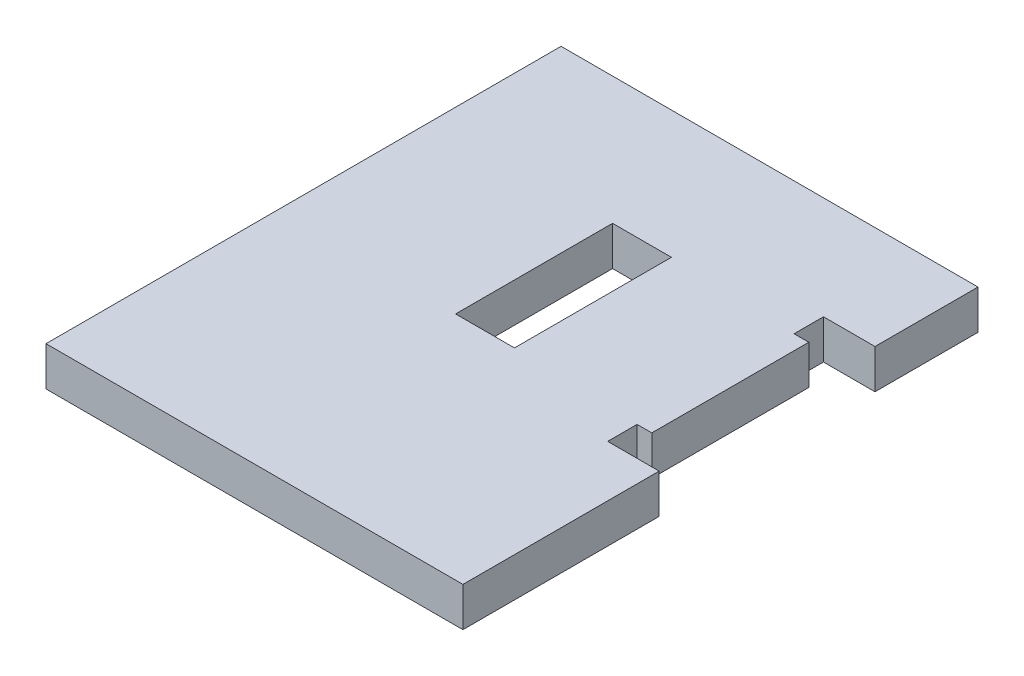
ISO-10303-21;
HEADER;
FILE_DESCRIPTION(('STEP AP214'),'2;1');
FILE_NAME('part.step','',(''),(''),'','','');
FILE_SCHEMA(('AUTOMOTIVE_DESIGN { 1 0 10303 214 1 1 1 1 }'));
ENDSEC;
DATA;
#1=APPLICATION_CONTEXT('core data for automotive mechanical design processes');
#2=APPLICATION_PROTOCOL_DEFINITION('international standard','automotive_design',2000,#1);
#3=PRODUCT_CONTEXT('',#1,'mechanical');
#4=PRODUCT('Part','Part','',(#3));
#5=PRODUCT_RELATED_PRODUCT_CATEGORY('part','',(#4));
#6=PRODUCT_DEFINITION_FORMATION('','',#4);
#7=PRODUCT_DEFINITION_CONTEXT('part definition',#1,'design');
#8=PRODUCT_DEFINITION('design','',#6,#7);
#9=PRODUCT_DEFINITION_SHAPE('','',#8);
#10=(LENGTH_UNIT() NAMED_UNIT(*) SI_UNIT(.MILLI.,.METRE.));
#11=(NAMED_UNIT(*) PLANE_ANGLE_UNIT() SI_UNIT($,.RADIAN.));
#12=(NAMED_UNIT(*) SI_UNIT($,.STERADIAN.) SOLID_ANGLE_UNIT());
#13=UNCERTAINTY_MEASURE_WITH_UNIT(LENGTH_MEASURE(1.E-05),#10,'distance_accuracy_value','');
#14=(GEOMETRIC_REPRESENTATION_CONTEXT(3) GLOBAL_UNCERTAINTY_ASSIGNED_CONTEXT((#13)) GLOBAL_UNIT_ASSIGNED_CONTEXT((#10,
#11,#12)) REPRESENTATION_CONTEXT('',''));
#15=CARTESIAN_POINT('',(0.,0.,0.));
#16=DIRECTION('',(0.,0.,1.));
#17=DIRECTION('',(1.,0.,0.));
#18=AXIS2_PLACEMENT_3D('',#15,#16,#17);
#19=CARTESIAN_POINT('',(0.,1.6,-21.));
#20=DIRECTION('',(-1.,0.,0.));
#21=DIRECTION('',(0.,0.,1.));
#22=AXIS2_PLACEMENT_3D('',#19,#20,#21);
#23=PLANE('',#22);
#24=DIRECTION('',(0.,0.,-1.));
#25=VECTOR('',#24,1.);
#26=CARTESIAN_POINT('',(0.,0.,-21.));
#27=LINE('',#26,#25);
#28=CARTESIAN_POINT('',(0.,0.,0.));
#29=VERTEX_POINT('',#28);
#30=CARTESIAN_POINT('',(0.,0.,-8.));
#31=VERTEX_POINT('',#30);
#32=EDGE_CURVE('E191',#29,#31,#27,.T.);
#33=ORIENTED_EDGE('',*,*,#32,.T.);
#34=DIRECTION('',(0.,1.,0.));
#35=VECTOR('',#34,1.);
#36=CARTESIAN_POINT('',(0.,-8.4,-8.));
#37=LINE('',#36,#35);
#38=CARTESIAN_POINT('',(0.,1.6,-8.));
#39=VERTEX_POINT('',#38);
#40=EDGE_CURVE('E249',#31,#39,#37,.T.);
#41=ORIENTED_EDGE('',*,*,#40,.T.);
#42=DIRECTION('',(0.,0.,-1.));
#43=VECTOR('',#42,1.);
#44=CARTESIAN_POINT('',(0.,1.6,-21.));
#45=LINE('',#44,#43);
#46=CARTESIAN_POINT('',(0.,1.6,0.));
#47=VERTEX_POINT('',#46);
#48=EDGE_CURVE('E173',#47,#39,#45,.T.);
#49=ORIENTED_EDGE('',*,*,#48,.F.);
#50=DIRECTION('',(0.,-1.,0.));
#51=VECTOR('',#50,1.);
#52=CARTESIAN_POINT('',(0.,1.6,0.));
#53=LINE('',#52,#51);
#54=EDGE_CURVE('E199',#47,#29,#53,.T.);
#55=ORIENTED_EDGE('',*,*,#54,.T.);
#56=EDGE_LOOP('',(#33,#41,#49,#55));
#57=FACE_BOUND('',#56,.T.);
#58=ADVANCED_FACE('F35',(#57),#23,.F.);
#59=CARTESIAN_POINT('',(-17.,1.6,-21.));
#60=DIRECTION('',(1.,0.,0.));
#61=DIRECTION('',(0.,0.,-1.));
#62=AXIS2_PLACEMENT_3D('',#59,#60,#61);
#63=PLANE('',#62);
#64=DIRECTION('',(0.,0.,1.));
#65=VECTOR('',#64,1.);
#66=CARTESIAN_POINT('',(-17.,0.,-21.));
#67=LINE('',#66,#65);
#68=CARTESIAN_POINT('',(-17.,0.,-21.));
#69=VERTEX_POINT('',#68);
#70=CARTESIAN_POINT('',(-17.,0.,0.));
#71=VERTEX_POINT('',#70);
#72=EDGE_CURVE('E184',#69,#71,#67,.T.);
#73=ORIENTED_EDGE('',*,*,#72,.T.);
#74=DIRECTION('',(0.,-1.,0.));
#75=VECTOR('',#74,1.);
#76=CARTESIAN_POINT('',(-17.,1.6,0.));
#77=LINE('',#76,#75);
#78=CARTESIAN_POINT('',(-17.,1.6,0.));
#79=VERTEX_POINT('',#78);
#80=EDGE_CURVE('E202',#79,#71,#77,.T.);
#81=ORIENTED_EDGE('',*,*,#80,.F.);
#82=DIRECTION('',(0.,0.,1.));
#83=VECTOR('',#82,1.);
#84=CARTESIAN_POINT('',(-17.,1.6,-21.));
#85=LINE('',#84,#83);
#86=CARTESIAN_POINT('',(-17.,1.6,-21.));
#87=VERTEX_POINT('',#86);
#88=EDGE_CURVE('E178',#87,#79,#85,.T.);
#89=ORIENTED_EDGE('',*,*,#88,.F.);
#90=DIRECTION('',(0.,-1.,0.));
#91=VECTOR('',#90,1.);
#92=CARTESIAN_POINT('',(-17.,1.6,-21.));
#93=LINE('',#92,#91);
#94=EDGE_CURVE('E183',#87,#69,#93,.T.);
#95=ORIENTED_EDGE('',*,*,#94,.T.);
#96=EDGE_LOOP('',(#73,#81,#89,#95));
#97=FACE_BOUND('',#96,.T.);
#98=ADVANCED_FACE('F37',(#97),#63,.F.);
#99=CARTESIAN_POINT('',(-17.,1.6,0.));
#100=DIRECTION('',(0.,0.,-1.));
#101=DIRECTION('',(-1.,0.,0.));
#102=AXIS2_PLACEMENT_3D('',#99,#100,#101);
#103=PLANE('',#102);
#104=DIRECTION('',(1.,0.,0.));
#105=VECTOR('',#104,1.);
#106=CARTESIAN_POINT('',(-17.,0.,0.));
#107=LINE('',#106,#105);
#108=EDGE_CURVE('E187',#71,#29,#107,.T.);
#109=ORIENTED_EDGE('',*,*,#108,.T.);
#110=ORIENTED_EDGE('',*,*,#54,.F.);
#111=DIRECTION('',(1.,0.,0.));
#112=VECTOR('',#111,1.);
#113=CARTESIAN_POINT('',(-17.,1.6,0.));
#114=LINE('',#113,#112);
#115=EDGE_CURVE('E174',#79,#47,#114,.T.);
#116=ORIENTED_EDGE('',*,*,#115,.F.);
#117=ORIENTED_EDGE('',*,*,#80,.T.);
#118=EDGE_LOOP('',(#109,#110,#116,#117));
#119=FACE_BOUND('',#118,.T.);
#120=ADVANCED_FACE('F283',(#119),#103,.F.);
#121=CARTESIAN_POINT('',(0.,1.6,-16.8));
#122=VERTEX_POINT('',#121);
#123=CARTESIAN_POINT('',(0.,1.6,-21.));
#124=VERTEX_POINT('',#123);
#125=EDGE_CURVE('E163',#122,#124,#45,.T.);
#126=ORIENTED_EDGE('',*,*,#125,.F.);
#127=DIRECTION('',(0.,1.,0.));
#128=VECTOR('',#127,1.);
#129=CARTESIAN_POINT('',(0.,-8.4,-16.8));
#130=LINE('',#129,#128);
#131=CARTESIAN_POINT('',(0.,0.,-16.8));
#132=VERTEX_POINT('',#131);
#133=EDGE_CURVE('E147',#132,#122,#130,.T.);
#134=ORIENTED_EDGE('',*,*,#133,.F.);
#135=CARTESIAN_POINT('',(0.,0.,-21.));
#136=VERTEX_POINT('',#135);
#137=EDGE_CURVE('E190',#132,#136,#27,.T.);
#138=ORIENTED_EDGE('',*,*,#137,.T.);
#139=DIRECTION('',(0.,-1.,0.));
#140=VECTOR('',#139,1.);
#141=CARTESIAN_POINT('',(0.,1.6,-21.));
#142=LINE('',#141,#140);
#143=EDGE_CURVE('E171',#124,#136,#142,.T.);
#144=ORIENTED_EDGE('',*,*,#143,.F.);
#145=EDGE_LOOP('',(#126,#134,#138,#144));
#146=FACE_BOUND('',#145,.T.);
#147=ADVANCED_FACE('F169',(#146),#23,.F.);
#148=CARTESIAN_POINT('',(-17.,1.6,-21.));
#149=DIRECTION('',(0.,0.,1.));
#150=DIRECTION('',(1.,0.,0.));
#151=AXIS2_PLACEMENT_3D('',#148,#149,#150);
#152=PLANE('',#151);
#153=DIRECTION('',(-1.,0.,0.));
#154=VECTOR('',#153,1.);
#155=CARTESIAN_POINT('',(-17.,0.,-21.));
#156=LINE('',#155,#154);
#157=EDGE_CURVE('E194',#136,#69,#156,.T.);
#158=ORIENTED_EDGE('',*,*,#157,.T.);
#159=ORIENTED_EDGE('',*,*,#94,.F.);
#160=DIRECTION('',(-1.,0.,0.));
#161=VECTOR('',#160,1.);
#162=CARTESIAN_POINT('',(-17.,1.6,-21.));
#163=LINE('',#162,#161);
#164=EDGE_CURVE('E177',#124,#87,#163,.T.);
#165=ORIENTED_EDGE('',*,*,#164,.F.);
#166=ORIENTED_EDGE('',*,*,#143,.T.);
#167=EDGE_LOOP('',(#158,#159,#165,#166));
#168=FACE_BOUND('',#167,.T.);
#169=ADVANCED_FACE('F308',(#168),#152,.F.);
#170=CARTESIAN_POINT('',(0.,1.6,0.));
#171=DIRECTION('',(0.,1.,0.));
#172=DIRECTION('',(0.,0.,1.));
#173=AXIS2_PLACEMENT_3D('',#170,#171,#172);
#174=PLANE('',#173);
#175=DIRECTION('',(1.,0.,0.));
#176=VECTOR('',#175,1.);
#177=CARTESIAN_POINT('',(0.,1.6,-8.));
#178=LINE('',#177,#176);
#179=CARTESIAN_POINT('',(-2.1,1.6,-8.));
#180=VERTEX_POINT('',#179);
#181=EDGE_CURVE('E157',#180,#39,#178,.T.);
#182=ORIENTED_EDGE('',*,*,#181,.F.);
#183=DIRECTION('',(0.,0.,1.));
#184=VECTOR('',#183,1.);
#185=CARTESIAN_POINT('',(-2.1,1.6,-8.));
#186=LINE('',#185,#184);
#187=CARTESIAN_POINT('',(-2.1,1.6,-9.2));
#188=VERTEX_POINT('',#187);
#189=EDGE_CURVE('E287',#188,#180,#186,.T.);
#190=ORIENTED_EDGE('',*,*,#189,.F.);
#191=DIRECTION('',(-1.,0.,0.));
#192=VECTOR('',#191,1.);
#193=CARTESIAN_POINT('',(-2.1,1.6,-9.2));
#194=LINE('',#193,#192);
#195=CARTESIAN_POINT('',(-1.5,1.6,-9.2));
#196=VERTEX_POINT('',#195);
#197=EDGE_CURVE('E245',#196,#188,#194,.T.);
#198=ORIENTED_EDGE('',*,*,#197,.F.);
#199=DIRECTION('',(0.,0.,1.));
#200=VECTOR('',#199,1.);
#201=CARTESIAN_POINT('',(-1.5,1.6,-15.6));
#202=LINE('',#201,#200);
#203=CARTESIAN_POINT('',(-1.5,1.6,-15.6));
#204=VERTEX_POINT('',#203);
#205=EDGE_CURVE('E293',#204,#196,#202,.T.);
#206=ORIENTED_EDGE('',*,*,#205,.F.);
#207=DIRECTION('',(1.,0.,0.));
#208=VECTOR('',#207,1.);
#209=CARTESIAN_POINT('',(-2.1,1.6,-15.6));
#210=LINE('',#209,#208);
#211=CARTESIAN_POINT('',(-2.1,1.6,-15.6));
#212=VERTEX_POINT('',#211);
#213=EDGE_CURVE('E296',#212,#204,#210,.T.);
#214=ORIENTED_EDGE('',*,*,#213,.F.);
#215=DIRECTION('',(0.,0.,1.));
#216=VECTOR('',#215,1.);
#217=CARTESIAN_POINT('',(-2.1,1.6,-16.8));
#218=LINE('',#217,#216);
#219=CARTESIAN_POINT('',(-2.1,1.6,-16.8));
#220=VERTEX_POINT('',#219);
#221=EDGE_CURVE('E167',#220,#212,#218,.T.);
#222=ORIENTED_EDGE('',*,*,#221,.F.);
#223=DIRECTION('',(-1.,0.,0.));
#224=VECTOR('',#223,1.);
#225=CARTESIAN_POINT('',(-1.5,1.6,-16.8));
#226=LINE('',#225,#224);
#227=EDGE_CURVE('E150',#122,#220,#226,.T.);
#228=ORIENTED_EDGE('',*,*,#227,.F.);
#229=ORIENTED_EDGE('',*,*,#125,.T.);
#230=ORIENTED_EDGE('',*,*,#164,.T.);
#231=ORIENTED_EDGE('',*,*,#88,.T.);
#232=ORIENTED_EDGE('',*,*,#115,.T.);
#233=ORIENTED_EDGE('',*,*,#48,.T.);
#234=EDGE_LOOP('',(#182,#190,#198,#206,#214,#222,#228,#229,#230,#231,#232,#233));
#235=FACE_BOUND('',#234,.T.);
#236=DIRECTION('',(0.,0.,1.));
#237=VECTOR('',#236,1.);
#238=CARTESIAN_POINT('',(-9.7,1.6,-15.8));
#239=LINE('',#238,#237);
#240=CARTESIAN_POINT('',(-9.7,1.6,-15.8));
#241=VERTEX_POINT('',#240);
#242=CARTESIAN_POINT('',(-9.7,1.6,-9.4));
#243=VERTEX_POINT('',#242);
#244=EDGE_CURVE('E58',#241,#243,#239,.T.);
#245=ORIENTED_EDGE('',*,*,#244,.F.);
#246=DIRECTION('',(-1.,0.,0.));
#247=VECTOR('',#246,1.);
#248=CARTESIAN_POINT('',(-9.7,1.6,-15.8));
#249=LINE('',#248,#247);
#250=CARTESIAN_POINT('',(-7.3,1.6,-15.8));
#251=VERTEX_POINT('',#250);
#252=EDGE_CURVE('E266',#251,#241,#249,.T.);
#253=ORIENTED_EDGE('',*,*,#252,.F.);
#254=DIRECTION('',(0.,0.,-1.));
#255=VECTOR('',#254,1.);
#256=CARTESIAN_POINT('',(-7.3,1.6,-15.8));
#257=LINE('',#256,#255);
#258=CARTESIAN_POINT('',(-7.3,1.6,-9.4));
#259=VERTEX_POINT('',#258);
#260=EDGE_CURVE('E263',#259,#251,#257,.T.);
#261=ORIENTED_EDGE('',*,*,#260,.F.);
#262=DIRECTION('',(1.,0.,0.));
#263=VECTOR('',#262,1.);
#264=CARTESIAN_POINT('',(-9.7,1.6,-9.4));
#265=LINE('',#264,#263);
#266=EDGE_CURVE('E260',#243,#259,#265,.T.);
#267=ORIENTED_EDGE('',*,*,#266,.F.);
#268=EDGE_LOOP('',(#245,#253,#261,#267));
#269=FACE_BOUND('',#268,.T.);
#270=ADVANCED_FACE('F161',(#235,#269),#174,.T.);
#271=CARTESIAN_POINT('',(0.,0.,0.));
#272=DIRECTION('',(0.,1.,0.));
#273=DIRECTION('',(0.,0.,1.));
#274=AXIS2_PLACEMENT_3D('',#271,#272,#273);
#275=PLANE('',#274);
#276=DIRECTION('',(-1.,0.,0.));
#277=VECTOR('',#276,1.);
#278=CARTESIAN_POINT('',(0.,0.,-15.8));
#279=LINE('',#278,#277);
#280=CARTESIAN_POINT('',(-7.3,0.,-15.8));
#281=VERTEX_POINT('',#280);
#282=CARTESIAN_POINT('',(-9.7,0.,-15.8));
#283=VERTEX_POINT('',#282);
#284=EDGE_CURVE('E211',#281,#283,#279,.T.);
#285=ORIENTED_EDGE('',*,*,#284,.T.);
#286=DIRECTION('',(0.,0.,1.));
#287=VECTOR('',#286,1.);
#288=CARTESIAN_POINT('',(-9.7,0.,0.));
#289=LINE('',#288,#287);
#290=CARTESIAN_POINT('',(-9.7,0.,-9.4));
#291=VERTEX_POINT('',#290);
#292=EDGE_CURVE('E214',#283,#291,#289,.T.);
#293=ORIENTED_EDGE('',*,*,#292,.T.);
#294=DIRECTION('',(1.,0.,0.));
#295=VECTOR('',#294,1.);
#296=CARTESIAN_POINT('',(0.,0.,-9.4));
#297=LINE('',#296,#295);
#298=CARTESIAN_POINT('',(-7.3,0.,-9.4));
#299=VERTEX_POINT('',#298);
#300=EDGE_CURVE('E205',#291,#299,#297,.T.);
#301=ORIENTED_EDGE('',*,*,#300,.T.);
#302=DIRECTION('',(0.,0.,-1.));
#303=VECTOR('',#302,1.);
#304=CARTESIAN_POINT('',(-7.3,0.,0.));
#305=LINE('',#304,#303);
#306=EDGE_CURVE('E208',#299,#281,#305,.T.);
#307=ORIENTED_EDGE('',*,*,#306,.T.);
#308=EDGE_LOOP('',(#285,#293,#301,#307));
#309=FACE_BOUND('',#308,.T.);
#310=DIRECTION('',(0.,0.,1.));
#311=VECTOR('',#310,1.);
#312=CARTESIAN_POINT('',(-2.1,0.,0.));
#313=LINE('',#312,#311);
#314=CARTESIAN_POINT('',(-2.1,0.,-9.2));
#315=VERTEX_POINT('',#314);
#316=CARTESIAN_POINT('',(-2.1,0.,-8.));
#317=VERTEX_POINT('',#316);
#318=EDGE_CURVE('E43',#315,#317,#313,.T.);
#319=ORIENTED_EDGE('',*,*,#318,.T.);
#320=DIRECTION('',(1.,0.,0.));
#321=VECTOR('',#320,1.);
#322=CARTESIAN_POINT('',(0.,0.,-8.));
#323=LINE('',#322,#321);
#324=EDGE_CURVE('E11',#317,#31,#323,.T.);
#325=ORIENTED_EDGE('',*,*,#324,.T.);
#326=ORIENTED_EDGE('',*,*,#32,.F.);
#327=ORIENTED_EDGE('',*,*,#108,.F.);
#328=ORIENTED_EDGE('',*,*,#72,.F.);
#329=ORIENTED_EDGE('',*,*,#157,.F.);
#330=ORIENTED_EDGE('',*,*,#137,.F.);
#331=DIRECTION('',(-1.,0.,0.));
#332=VECTOR('',#331,1.);
#333=CARTESIAN_POINT('',(0.,0.,-16.8));
#334=LINE('',#333,#332);
#335=CARTESIAN_POINT('',(-2.1,0.,-16.8));
#336=VERTEX_POINT('',#335);
#337=EDGE_CURVE('E153',#132,#336,#334,.T.);
#338=ORIENTED_EDGE('',*,*,#337,.T.);
#339=DIRECTION('',(0.,0.,1.));
#340=VECTOR('',#339,1.);
#341=CARTESIAN_POINT('',(-2.1,0.,0.));
#342=LINE('',#341,#340);
#343=CARTESIAN_POINT('',(-2.1,0.,-15.6));
#344=VERTEX_POINT('',#343);
#345=EDGE_CURVE('E218',#336,#344,#342,.T.);
#346=ORIENTED_EDGE('',*,*,#345,.T.);
#347=DIRECTION('',(1.,0.,0.));
#348=VECTOR('',#347,1.);
#349=CARTESIAN_POINT('',(0.,0.,-15.6));
#350=LINE('',#349,#348);
#351=CARTESIAN_POINT('',(-1.5,0.,-15.6));
#352=VERTEX_POINT('',#351);
#353=EDGE_CURVE('E221',#344,#352,#350,.T.);
#354=ORIENTED_EDGE('',*,*,#353,.T.);
#355=DIRECTION('',(0.,0.,1.));
#356=VECTOR('',#355,1.);
#357=CARTESIAN_POINT('',(-1.5,0.,0.));
#358=LINE('',#357,#356);
#359=CARTESIAN_POINT('',(-1.5,0.,-9.2));
#360=VERTEX_POINT('',#359);
#361=EDGE_CURVE('E224',#352,#360,#358,.T.);
#362=ORIENTED_EDGE('',*,*,#361,.T.);
#363=DIRECTION('',(-1.,0.,0.));
#364=VECTOR('',#363,1.);
#365=CARTESIAN_POINT('',(0.,0.,-9.2));
#366=LINE('',#365,#364);
#367=EDGE_CURVE('E227',#360,#315,#366,.T.);
#368=ORIENTED_EDGE('',*,*,#367,.T.);
#369=EDGE_LOOP('',(#319,#325,#326,#327,#328,#329,#330,#338,#346,#354,#362,#368));
#370=FACE_BOUND('',#369,.T.);
#371=ADVANCED_FACE('F231',(#309,#370),#275,.F.);
#372=CARTESIAN_POINT('',(-9.7,-8.4,-15.8));
#373=DIRECTION('',(-1.,0.,0.));
#374=DIRECTION('',(0.,0.,1.));
#375=AXIS2_PLACEMENT_3D('',#372,#373,#374);
#376=PLANE('',#375);
#377=DIRECTION('',(0.,1.,0.));
#378=VECTOR('',#377,1.);
#379=CARTESIAN_POINT('',(-9.7,-8.4,-15.8));
#380=LINE('',#379,#378);
#381=EDGE_CURVE('E188',#283,#241,#380,.T.);
#382=ORIENTED_EDGE('',*,*,#381,.T.);
#383=ORIENTED_EDGE('',*,*,#244,.T.);
#384=DIRECTION('',(0.,1.,0.));
#385=VECTOR('',#384,1.);
#386=CARTESIAN_POINT('',(-9.7,-8.4,-9.4));
#387=LINE('',#386,#385);
#388=EDGE_CURVE('E269',#291,#243,#387,.T.);
#389=ORIENTED_EDGE('',*,*,#388,.F.);
#390=ORIENTED_EDGE('',*,*,#292,.F.);
#391=EDGE_LOOP('',(#382,#383,#389,#390));
#392=FACE_BOUND('',#391,.T.);
#393=ADVANCED_FACE('F345',(#392),#376,.F.);
#394=CARTESIAN_POINT('',(-9.7,-8.4,-15.8));
#395=DIRECTION('',(0.,0.,-1.));
#396=DIRECTION('',(-1.,0.,0.));
#397=AXIS2_PLACEMENT_3D('',#394,#395,#396);
#398=PLANE('',#397);
#399=DIRECTION('',(0.,1.,0.));
#400=VECTOR('',#399,1.);
#401=CARTESIAN_POINT('',(-7.3,-8.4,-15.8));
#402=LINE('',#401,#400);
#403=EDGE_CURVE('E271',#281,#251,#402,.T.);
#404=ORIENTED_EDGE('',*,*,#403,.T.);
#405=ORIENTED_EDGE('',*,*,#252,.T.);
#406=ORIENTED_EDGE('',*,*,#381,.F.);
#407=ORIENTED_EDGE('',*,*,#284,.F.);
#408=EDGE_LOOP('',(#404,#405,#406,#407));
#409=FACE_BOUND('',#408,.T.);
#410=ADVANCED_FACE('F415',(#409),#398,.F.);
#411=CARTESIAN_POINT('',(-7.3,-8.4,-15.8));
#412=DIRECTION('',(1.,0.,0.));
#413=DIRECTION('',(0.,0.,-1.));
#414=AXIS2_PLACEMENT_3D('',#411,#412,#413);
#415=PLANE('',#414);
#416=DIRECTION('',(0.,1.,0.));
#417=VECTOR('',#416,1.);
#418=CARTESIAN_POINT('',(-7.3,-8.4,-9.4));
#419=LINE('',#418,#417);
#420=EDGE_CURVE('E273',#299,#259,#419,.T.);
#421=ORIENTED_EDGE('',*,*,#420,.T.);
#422=ORIENTED_EDGE('',*,*,#260,.T.);
#423=ORIENTED_EDGE('',*,*,#403,.F.);
#424=ORIENTED_EDGE('',*,*,#306,.F.);
#425=EDGE_LOOP('',(#421,#422,#423,#424));
#426=FACE_BOUND('',#425,.T.);
#427=ADVANCED_FACE('F418',(#426),#415,.F.);
#428=CARTESIAN_POINT('',(-9.7,-8.4,-9.4));
#429=DIRECTION('',(0.,0.,1.));
#430=DIRECTION('',(1.,0.,0.));
#431=AXIS2_PLACEMENT_3D('',#428,#429,#430);
#432=PLANE('',#431);
#433=ORIENTED_EDGE('',*,*,#388,.T.);
#434=ORIENTED_EDGE('',*,*,#266,.T.);
#435=ORIENTED_EDGE('',*,*,#420,.F.);
#436=ORIENTED_EDGE('',*,*,#300,.F.);
#437=EDGE_LOOP('',(#433,#434,#435,#436));
#438=FACE_BOUND('',#437,.T.);
#439=ADVANCED_FACE('F355',(#438),#432,.F.);
#440=CARTESIAN_POINT('',(0.,-8.4,-8.));
#441=DIRECTION('',(0.,0.,1.));
#442=DIRECTION('',(1.,0.,0.));
#443=AXIS2_PLACEMENT_3D('',#440,#441,#442);
#444=PLANE('',#443);
#445=DIRECTION('',(0.,1.,0.));
#446=VECTOR('',#445,1.);
#447=CARTESIAN_POINT('',(-2.1,-8.4,-8.));
#448=LINE('',#447,#446);
#449=EDGE_CURVE('E240',#317,#180,#448,.T.);
#450=ORIENTED_EDGE('',*,*,#449,.T.);
#451=ORIENTED_EDGE('',*,*,#181,.T.);
#452=ORIENTED_EDGE('',*,*,#40,.F.);
#453=ORIENTED_EDGE('',*,*,#324,.F.);
#454=EDGE_LOOP('',(#450,#451,#452,#453));
#455=FACE_BOUND('',#454,.T.);
#456=ADVANCED_FACE('F350',(#455),#444,.F.);
#457=CARTESIAN_POINT('',(-2.1,-8.4,-8.));
#458=DIRECTION('',(-1.,0.,0.));
#459=DIRECTION('',(0.,0.,1.));
#460=AXIS2_PLACEMENT_3D('',#457,#458,#459);
#461=PLANE('',#460);
#462=DIRECTION('',(0.,1.,0.));
#463=VECTOR('',#462,1.);
#464=CARTESIAN_POINT('',(-2.1,-8.4,-9.2));
#465=LINE('',#464,#463);
#466=EDGE_CURVE('E238',#315,#188,#465,.T.);
#467=ORIENTED_EDGE('',*,*,#466,.T.);
#468=ORIENTED_EDGE('',*,*,#189,.T.);
#469=ORIENTED_EDGE('',*,*,#449,.F.);
#470=ORIENTED_EDGE('',*,*,#318,.F.);
#471=EDGE_LOOP('',(#467,#468,#469,#470));
#472=FACE_BOUND('',#471,.T.);
#473=ADVANCED_FACE('F236',(#472),#461,.F.);
#474=CARTESIAN_POINT('',(-2.1,-8.4,-9.2));
#475=DIRECTION('',(0.,0.,-1.));
#476=DIRECTION('',(-1.,0.,0.));
#477=AXIS2_PLACEMENT_3D('',#474,#475,#476);
#478=PLANE('',#477);
#479=DIRECTION('',(0.,1.,0.));
#480=VECTOR('',#479,1.);
#481=CARTESIAN_POINT('',(-1.5,-8.4,-9.2));
#482=LINE('',#481,#480);
#483=EDGE_CURVE('E247',#360,#196,#482,.T.);
#484=ORIENTED_EDGE('',*,*,#483,.T.);
#485=ORIENTED_EDGE('',*,*,#197,.T.);
#486=ORIENTED_EDGE('',*,*,#466,.F.);
#487=ORIENTED_EDGE('',*,*,#367,.F.);
#488=EDGE_LOOP('',(#484,#485,#486,#487));
#489=FACE_BOUND('',#488,.T.);
#490=ADVANCED_FACE('F242',(#489),#478,.F.);
#491=CARTESIAN_POINT('',(-1.5,-8.4,-15.6));
#492=DIRECTION('',(-1.,0.,0.));
#493=DIRECTION('',(0.,0.,1.));
#494=AXIS2_PLACEMENT_3D('',#491,#492,#493);
#495=PLANE('',#494);
#496=DIRECTION('',(0.,1.,0.));
#497=VECTOR('',#496,1.);
#498=CARTESIAN_POINT('',(-1.5,-8.4,-15.6));
#499=LINE('',#498,#497);
#500=EDGE_CURVE('E251',#352,#204,#499,.T.);
#501=ORIENTED_EDGE('',*,*,#500,.T.);
#502=ORIENTED_EDGE('',*,*,#205,.T.);
#503=ORIENTED_EDGE('',*,*,#483,.F.);
#504=ORIENTED_EDGE('',*,*,#361,.F.);
#505=EDGE_LOOP('',(#501,#502,#503,#504));
#506=FACE_BOUND('',#505,.T.);
#507=ADVANCED_FACE('F374',(#506),#495,.F.);
#508=CARTESIAN_POINT('',(-2.1,-8.4,-15.6));
#509=DIRECTION('',(0.,0.,1.));
#510=DIRECTION('',(1.,0.,0.));
#511=AXIS2_PLACEMENT_3D('',#508,#509,#510);
#512=PLANE('',#511);
#513=DIRECTION('',(0.,1.,0.));
#514=VECTOR('',#513,1.);
#515=CARTESIAN_POINT('',(-2.1,-8.4,-15.6));
#516=LINE('',#515,#514);
#517=EDGE_CURVE('E256',#344,#212,#516,.T.);
#518=ORIENTED_EDGE('',*,*,#517,.T.);
#519=ORIENTED_EDGE('',*,*,#213,.T.);
#520=ORIENTED_EDGE('',*,*,#500,.F.);
#521=ORIENTED_EDGE('',*,*,#353,.F.);
#522=EDGE_LOOP('',(#518,#519,#520,#521));
#523=FACE_BOUND('',#522,.T.);
#524=ADVANCED_FACE('F305',(#523),#512,.F.);
#525=CARTESIAN_POINT('',(-2.1,-8.4,-16.8));
#526=DIRECTION('',(-1.,0.,0.));
#527=DIRECTION('',(0.,0.,1.));
#528=AXIS2_PLACEMENT_3D('',#525,#526,#527);
#529=PLANE('',#528);
#530=DIRECTION('',(0.,1.,0.));
#531=VECTOR('',#530,1.);
#532=CARTESIAN_POINT('',(-2.1,-8.4,-16.8));
#533=LINE('',#532,#531);
#534=EDGE_CURVE('E50',#336,#220,#533,.T.);
#535=ORIENTED_EDGE('',*,*,#534,.T.);
#536=ORIENTED_EDGE('',*,*,#221,.T.);
#537=ORIENTED_EDGE('',*,*,#517,.F.);
#538=ORIENTED_EDGE('',*,*,#345,.F.);
#539=EDGE_LOOP('',(#535,#536,#537,#538));
#540=FACE_BOUND('',#539,.T.);
#541=ADVANCED_FACE('F301',(#540),#529,.F.);
#542=CARTESIAN_POINT('',(-1.5,-8.4,-16.8));
#543=DIRECTION('',(0.,0.,-1.));
#544=DIRECTION('',(-1.,0.,0.));
#545=AXIS2_PLACEMENT_3D('',#542,#543,#544);
#546=PLANE('',#545);
#547=ORIENTED_EDGE('',*,*,#133,.T.);
#548=ORIENTED_EDGE('',*,*,#227,.T.);
#549=ORIENTED_EDGE('',*,*,#534,.F.);
#550=ORIENTED_EDGE('',*,*,#337,.F.);
#551=EDGE_LOOP('',(#547,#548,#549,#550));
#552=FACE_BOUND('',#551,.T.);
#553=ADVANCED_FACE('F149',(#552),#546,.F.);
#554=CLOSED_SHELL('',(#58,#98,#120,#147,#169,#270,#371,#393,#410,#427,#439,#456,#473,#490,#507,
#524,#541,#553));
#555=MANIFOLD_SOLID_BREP('B2',#554);
#556=ADVANCED_BREP_SHAPE_REPRESENTATION('',(#18,#555),#14);
#557=SHAPE_DEFINITION_REPRESENTATION(#9,#556);
ENDSEC;
END-ISO-10303-21;
